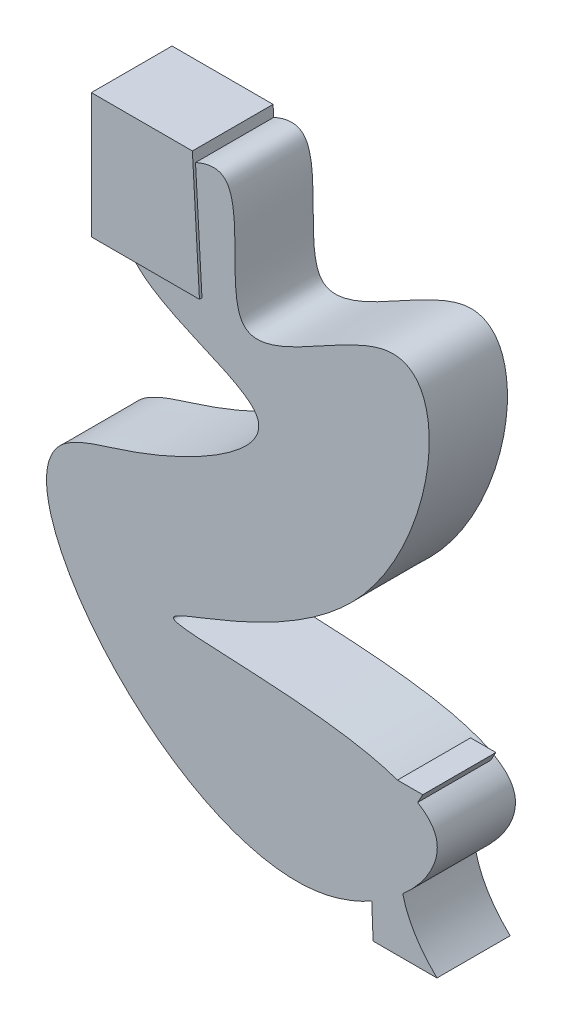
ISO-10303-21;
HEADER;
FILE_DESCRIPTION(('STEP AP214'),'2;1');
FILE_NAME('part.step','',(''),(''),'','','');
FILE_SCHEMA(('AUTOMOTIVE_DESIGN { 1 0 10303 214 1 1 1 1 }'));
ENDSEC;
DATA;
#1=APPLICATION_CONTEXT('core data for automotive mechanical design processes');
#2=APPLICATION_PROTOCOL_DEFINITION('international standard','automotive_design',2000,#1);
#3=PRODUCT_CONTEXT('',#1,'mechanical');
#4=PRODUCT('Part','Part','',(#3));
#5=PRODUCT_RELATED_PRODUCT_CATEGORY('part','',(#4));
#6=PRODUCT_DEFINITION_FORMATION('','',#4);
#7=PRODUCT_DEFINITION_CONTEXT('part definition',#1,'design');
#8=PRODUCT_DEFINITION('design','',#6,#7);
#9=PRODUCT_DEFINITION_SHAPE('','',#8);
#10=(LENGTH_UNIT() NAMED_UNIT(*) SI_UNIT(.MILLI.,.METRE.));
#11=(NAMED_UNIT(*) PLANE_ANGLE_UNIT() SI_UNIT($,.RADIAN.));
#12=(NAMED_UNIT(*) SI_UNIT($,.STERADIAN.) SOLID_ANGLE_UNIT());
#13=UNCERTAINTY_MEASURE_WITH_UNIT(LENGTH_MEASURE(1.E-05),#10,'distance_accuracy_value','');
#14=(GEOMETRIC_REPRESENTATION_CONTEXT(3) GLOBAL_UNCERTAINTY_ASSIGNED_CONTEXT((#13)) GLOBAL_UNIT_ASSIGNED_CONTEXT((#10,
#11,#12)) REPRESENTATION_CONTEXT('',''));
#15=CARTESIAN_POINT('',(0.,0.,0.));
#16=DIRECTION('',(0.,0.,1.));
#17=DIRECTION('',(1.,0.,0.));
#18=AXIS2_PLACEMENT_3D('',#15,#16,#17);
#19=CARTESIAN_POINT('',(-15.9579114672824,27.3125792420795,31.));
#20=CARTESIAN_POINT('',(-25.6408221690591,34.2496411082835,31.));
#21=CARTESIAN_POINT('',(-92.7059233373681,-25.2088498481276,31.));
#22=CARTESIAN_POINT('',(34.8425285028461,-42.1888332759727,31.));
#23=CARTESIAN_POINT('',(-42.5326846992211,-84.9102564767417,31.));
#24=CARTESIAN_POINT('',(-123.690777641917,-101.811790270533,31.));
#25=CARTESIAN_POINT('',(-5.24319580239329,-249.002191744904,31.));
#26=CARTESIAN_POINT('',(112.33595118914,-130.787067956798,31.));
#27=CARTESIAN_POINT('',(-101.777113136404,-142.952175341269,31.));
#28=CARTESIAN_POINT('',(61.7583482642269,-112.100404609053,31.));
#29=CARTESIAN_POINT('',(80.6764848376101,41.7227071032972,31.));
#30=CARTESIAN_POINT('',(-24.3178197996844,-52.6663732965618,31.));
#31=CARTESIAN_POINT('',(-7.43119536648631,21.2038420112459,31.));
#32=CARTESIAN_POINT('',(-15.9579114672824,27.3125792420795,31.));
#33=B_SPLINE_CURVE_WITH_KNOTS('',3,(#19,#20,#21,#22,#23,#24,#25,#26,#27,#28,#29,#30,#31,#32),
.UNSPECIFIED.,.T.,.F.,(4,1,1,1,1,1,1,1,1,1,1,4),(0.,0.0665290022160049,0.147826333462072,
0.222247527713655,0.261022342460717,0.442203314127407,0.516003534202006,0.647339484885778,
0.752660943172227,0.865759654440507,0.941414938974805,1.),.UNSPECIFIED.);
#34=DIRECTION('',(0.,0.,-1.));
#35=VECTOR('',#34,1.);
#36=SURFACE_OF_LINEAR_EXTRUSION('',#33,#35);
#37=CARTESIAN_POINT('',(55.189671373686,-183.461803067807,31.));
#38=VERTEX_POINT('',#37);
#39=CARTESIAN_POINT('',(61.0883800671705,-149.159472973881,31.));
#40=VERTEX_POINT('',#39);
#41=EDGE_CURVE('E278',#38,#40,#33,.T.);
#42=ORIENTED_EDGE('',*,*,#41,.F.);
#43=DIRECTION('',(0.,0.,1.));
#44=VECTOR('',#43,1.);
#45=CARTESIAN_POINT('',(55.1896713736861,-183.461803067807,2.00000000000002));
#46=LINE('',#45,#44);
#47=CARTESIAN_POINT('',(55.1896713736859,-183.461803067806,2.00000000000002));
#48=VERTEX_POINT('',#47);
#49=EDGE_CURVE('E210',#38,#48,#46,.F.);
#50=ORIENTED_EDGE('',*,*,#49,.T.);
#51=CARTESIAN_POINT('',(-15.9579114672824,27.3125792420795,2.00000000000002));
#52=CARTESIAN_POINT('',(-25.6408221690591,34.2496411082835,2.00000000000002));
#53=CARTESIAN_POINT('',(-92.7059233373681,-25.2088498481276,2.00000000000002));
#54=CARTESIAN_POINT('',(34.8425285028461,-42.1888332759727,2.00000000000002));
#55=CARTESIAN_POINT('',(-42.5326846992211,-84.9102564767417,2.00000000000002));
#56=CARTESIAN_POINT('',(-123.690777641917,-101.811790270533,2.00000000000002));
#57=CARTESIAN_POINT('',(-5.24319580239329,-249.002191744904,2.00000000000002));
#58=CARTESIAN_POINT('',(112.33595118914,-130.787067956798,2.00000000000002));
#59=CARTESIAN_POINT('',(-101.777113136404,-142.952175341269,2.00000000000002));
#60=CARTESIAN_POINT('',(61.7583482642269,-112.100404609053,2.00000000000002));
#61=CARTESIAN_POINT('',(80.6764848376101,41.7227071032972,2.00000000000002));
#62=CARTESIAN_POINT('',(-24.3178197996844,-52.6663732965618,2.00000000000002));
#63=CARTESIAN_POINT('',(-7.43119536648631,21.2038420112459,2.00000000000002));
#64=CARTESIAN_POINT('',(-15.9579114672824,27.3125792420795,2.00000000000002));
#65=B_SPLINE_CURVE_WITH_KNOTS('',3,(#51,#52,#53,#54,#55,#56,#57,#58,#59,#60,#61,#62,#63,#64),
.UNSPECIFIED.,.T.,.F.,(4,1,1,1,1,1,1,1,1,1,1,4),(0.,0.0665290022160049,0.147826333462072,
0.222247527713655,0.261022342460717,0.442203314127407,0.516003534202006,0.647339484885778,
0.752660943172227,0.865759654440507,0.941414938974805,1.),.UNSPECIFIED.);
#66=CARTESIAN_POINT('',(42.8929961040862,-192.125914514546,2.00000000000002));
#67=VERTEX_POINT('',#66);
#68=EDGE_CURVE('E11',#67,#48,#65,.T.);
#69=ORIENTED_EDGE('',*,*,#68,.F.);
#70=DIRECTION('',(0.,0.,-1.));
#71=VECTOR('',#70,1.);
#72=CARTESIAN_POINT('',(42.8929961040862,-192.125914514545,31.));
#73=LINE('',#72,#71);
#74=CARTESIAN_POINT('',(42.8929961040861,-192.125914514546,31.));
#75=VERTEX_POINT('',#74);
#76=EDGE_CURVE('E204',#67,#75,#73,.F.);
#77=ORIENTED_EDGE('',*,*,#76,.T.);
#78=CARTESIAN_POINT('',(-51.5784506059201,-18.6355593900152,31.));
#79=VERTEX_POINT('',#78);
#80=EDGE_CURVE('E272',#79,#75,#33,.T.);
#81=ORIENTED_EDGE('',*,*,#80,.F.);
#82=DIRECTION('',(0.,0.,-1.));
#83=VECTOR('',#82,1.);
#84=CARTESIAN_POINT('',(-51.5784506181621,-18.6355593749031,31.));
#85=LINE('',#84,#83);
#86=CARTESIAN_POINT('',(-51.5784506059201,-18.6355593900152,0.));
#87=VERTEX_POINT('',#86);
#88=EDGE_CURVE('E260',#87,#79,#85,.F.);
#89=ORIENTED_EDGE('',*,*,#88,.F.);
#90=CARTESIAN_POINT('',(-15.9579114672824,27.3125792420795,0.));
#91=CARTESIAN_POINT('',(-25.6408221690591,34.2496411082835,0.));
#92=CARTESIAN_POINT('',(-92.7059233373681,-25.2088498481276,0.));
#93=CARTESIAN_POINT('',(34.8425285028461,-42.1888332759727,0.));
#94=CARTESIAN_POINT('',(-42.5326846992211,-84.9102564767417,0.));
#95=CARTESIAN_POINT('',(-123.690777641917,-101.811790270533,0.));
#96=CARTESIAN_POINT('',(-5.24319580239329,-249.002191744904,0.));
#97=CARTESIAN_POINT('',(112.33595118914,-130.787067956798,0.));
#98=CARTESIAN_POINT('',(-101.777113136404,-142.952175341269,0.));
#99=CARTESIAN_POINT('',(61.7583482642269,-112.100404609053,0.));
#100=CARTESIAN_POINT('',(80.6764848376101,41.7227071032972,0.));
#101=CARTESIAN_POINT('',(-24.3178197996844,-52.6663732965618,0.));
#102=CARTESIAN_POINT('',(-7.43119536648631,21.2038420112459,0.));
#103=CARTESIAN_POINT('',(-15.9579114672824,27.3125792420795,0.));
#104=B_SPLINE_CURVE_WITH_KNOTS('',3,(#90,#91,#92,#93,#94,#95,#96,#97,#98,#99,#100,#101,#102,
#103),.UNSPECIFIED.,.T.,.F.,(4,1,1,1,1,1,1,1,1,1,1,4),(0.,0.0665290022160049,0.147826333462072,
0.222247527713655,0.261022342460717,0.442203314127407,0.516003534202006,0.647339484885778,
0.752660943172227,0.865759654440507,0.941414938974805,1.),.UNSPECIFIED.);
#105=CARTESIAN_POINT('',(-26.9784339330678,26.5567146381178,0.));
#106=VERTEX_POINT('',#105);
#107=EDGE_CURVE('E271',#87,#106,#104,.T.);
#108=ORIENTED_EDGE('',*,*,#107,.T.);
#109=DIRECTION('',(0.,0.,-1.));
#110=VECTOR('',#109,1.);
#111=CARTESIAN_POINT('',(-26.9784339332847,26.5567146380175,31.));
#112=LINE('',#111,#110);
#113=CARTESIAN_POINT('',(-26.9784339330678,26.5567146381178,31.));
#114=VERTEX_POINT('',#113);
#115=EDGE_CURVE('E268',#114,#106,#112,.T.);
#116=ORIENTED_EDGE('',*,*,#115,.F.);
#117=CARTESIAN_POINT('',(53.09308797691,-145.469515025717,31.));
#118=VERTEX_POINT('',#117);
#119=EDGE_CURVE('E279',#118,#114,#33,.T.);
#120=ORIENTED_EDGE('',*,*,#119,.F.);
#121=DIRECTION('',(0.,0.,-1.));
#122=VECTOR('',#121,1.);
#123=CARTESIAN_POINT('',(53.0930880176054,-145.469515040222,31.));
#124=LINE('',#123,#122);
#125=CARTESIAN_POINT('',(53.09308797691,-145.469515040222,2.00000000000002));
#126=VERTEX_POINT('',#125);
#127=EDGE_CURVE('E198',#118,#126,#124,.T.);
#128=ORIENTED_EDGE('',*,*,#127,.T.);
#129=CARTESIAN_POINT('',(61.0883800663589,-149.159472975432,2.00000000000002));
#130=VERTEX_POINT('',#129);
#131=EDGE_CURVE('E49',#130,#126,#65,.T.);
#132=ORIENTED_EDGE('',*,*,#131,.F.);
#133=DIRECTION('',(0.,0.,1.));
#134=VECTOR('',#133,1.);
#135=CARTESIAN_POINT('',(61.0883800671726,-149.159472973877,2.00000000000002));
#136=LINE('',#135,#134);
#137=EDGE_CURVE('E148',#130,#40,#136,.T.);
#138=ORIENTED_EDGE('',*,*,#137,.T.);
#139=EDGE_LOOP('',(#42,#50,#69,#77,#81,#89,#108,#116,#120,#128,#132,#138));
#140=FACE_BOUND('',#139,.T.);
#141=ADVANCED_FACE('F45',(#140),#36,.F.);
#142=CARTESIAN_POINT('',(67.5136866995857,-167.311195126365,31.));
#143=DIRECTION('',(0.,0.,-1.));
#144=DIRECTION('',(-1.,0.,0.));
#145=AXIS2_PLACEMENT_3D('',#142,#143,#144);
#146=PLANE('',#145);
#147=ORIENTED_EDGE('',*,*,#80,.T.);
#148=DIRECTION('',(0.0409014170082283,-0.99916318691529,0.));
#149=VECTOR('',#148,1.);
#150=CARTESIAN_POINT('',(40.9830850144939,-145.469515040222,31.));
#151=LINE('',#150,#149);
#152=CARTESIAN_POINT('',(43.444551911257,-205.599634946863,31.));
#153=VERTEX_POINT('',#152);
#154=EDGE_CURVE('E190',#75,#153,#151,.T.);
#155=ORIENTED_EDGE('',*,*,#154,.T.);
#156=DIRECTION('',(1.,0.,0.));
#157=VECTOR('',#156,1.);
#158=CARTESIAN_POINT('',(43.444551911257,-205.599634946863,31.));
#159=LINE('',#158,#157);
#160=CARTESIAN_POINT('',(68.7624971351058,-205.599634946863,31.));
#161=VERTEX_POINT('',#160);
#162=EDGE_CURVE('E154',#153,#161,#159,.T.);
#163=ORIENTED_EDGE('',*,*,#162,.T.);
#164=CARTESIAN_POINT('',(68.7624971351058,-205.599634946863,31.));
#165=CARTESIAN_POINT('',(42.6047193772417,-180.494440079804,31.));
#166=CARTESIAN_POINT('',(63.1362870853616,-145.469515040222,31.));
#167=B_SPLINE_CURVE_WITH_KNOTS('',2,(#164,#165,#166),.UNSPECIFIED.,.F.,.F.,(3,3),(0.,1.),.UNSPECIFIED.);
#168=EDGE_CURVE('E70',#161,#38,#167,.T.);
#169=ORIENTED_EDGE('',*,*,#168,.T.);
#170=ORIENTED_EDGE('',*,*,#41,.T.);
#171=CARTESIAN_POINT('',(63.1362870853616,-145.469515040222,31.));
#172=VERTEX_POINT('',#171);
#173=EDGE_CURVE('E184',#40,#172,#167,.T.);
#174=ORIENTED_EDGE('',*,*,#173,.T.);
#175=DIRECTION('',(-1.,0.,0.));
#176=VECTOR('',#175,1.);
#177=CARTESIAN_POINT('',(63.1362870853616,-145.469515040222,31.));
#178=LINE('',#177,#176);
#179=EDGE_CURVE('E63',#172,#118,#178,.T.);
#180=ORIENTED_EDGE('',*,*,#179,.T.);
#181=ORIENTED_EDGE('',*,*,#119,.T.);
#182=DIRECTION('',(-0.056646485034233,0.998394298728346,0.));
#183=VECTOR('',#182,1.);
#184=CARTESIAN_POINT('',(-15.7109233825337,-172.033158818968,31.));
#185=LINE('',#184,#183);
#186=CARTESIAN_POINT('',(-24.4143332800694,-18.6355593749031,31.));
#187=VERTEX_POINT('',#186);
#188=EDGE_CURVE('E264',#187,#114,#185,.T.);
#189=ORIENTED_EDGE('',*,*,#188,.F.);
#190=DIRECTION('',(1.,0.,0.));
#191=VECTOR('',#190,1.);
#192=CARTESIAN_POINT('',(67.5136866995857,-18.6355593749031,31.));
#193=LINE('',#192,#191);
#194=EDGE_CURVE('E256',#79,#187,#193,.T.);
#195=ORIENTED_EDGE('',*,*,#194,.F.);
#196=EDGE_LOOP('',(#147,#155,#163,#169,#170,#174,#180,#181,#189,#195));
#197=FACE_BOUND('',#196,.T.);
#198=ADVANCED_FACE('F296',(#197),#146,.F.);
#199=CARTESIAN_POINT('',(67.5136866995857,-167.311195126365,0.));
#200=DIRECTION('',(0.,0.,-1.));
#201=DIRECTION('',(-1.,0.,0.));
#202=AXIS2_PLACEMENT_3D('',#199,#200,#201);
#203=PLANE('',#202);
#204=ORIENTED_EDGE('',*,*,#107,.F.);
#205=DIRECTION('',(1.,0.,0.));
#206=VECTOR('',#205,1.);
#207=CARTESIAN_POINT('',(-67.2895357117868,-18.6355593749031,0.));
#208=LINE('',#207,#206);
#209=CARTESIAN_POINT('',(-67.2895357117868,-18.6355593749031,0.));
#210=VERTEX_POINT('',#209);
#211=EDGE_CURVE('E225',#210,#87,#208,.T.);
#212=ORIENTED_EDGE('',*,*,#211,.F.);
#213=DIRECTION('',(0.,-1.,0.));
#214=VECTOR('',#213,1.);
#215=CARTESIAN_POINT('',(-67.2895357117868,30.916928681426,0.));
#216=LINE('',#215,#214);
#217=CARTESIAN_POINT('',(-67.2895357117868,30.916928681426,0.));
#218=VERTEX_POINT('',#217);
#219=EDGE_CURVE('E221',#218,#210,#216,.T.);
#220=ORIENTED_EDGE('',*,*,#219,.F.);
#221=DIRECTION('',(-1.,0.,0.));
#222=VECTOR('',#221,1.);
#223=CARTESIAN_POINT('',(-27.2258219641164,30.916928681426,0.));
#224=LINE('',#223,#222);
#225=CARTESIAN_POINT('',(-27.2258219641164,30.916928681426,0.));
#226=VERTEX_POINT('',#225);
#227=EDGE_CURVE('E217',#226,#218,#224,.T.);
#228=ORIENTED_EDGE('',*,*,#227,.F.);
#229=DIRECTION('',(-0.056646485034233,0.998394298728346,0.));
#230=VECTOR('',#229,1.);
#231=CARTESIAN_POINT('',(-24.4143332800694,-18.6355593749031,0.));
#232=LINE('',#231,#230);
#233=EDGE_CURVE('E214',#106,#226,#232,.T.);
#234=ORIENTED_EDGE('',*,*,#233,.F.);
#235=EDGE_LOOP('',(#204,#212,#220,#228,#234));
#236=FACE_BOUND('',#235,.T.);
#237=ADVANCED_FACE('F310',(#236),#203,.T.);
#238=CARTESIAN_POINT('',(-24.4143332800694,-18.6355593749031,32.));
#239=DIRECTION('',(-0.998394298728346,-0.056646485034233,0.));
#240=DIRECTION('',(0.056646485034233,-0.998394298728346,0.));
#241=AXIS2_PLACEMENT_3D('',#238,#239,#240);
#242=PLANE('',#241);
#243=ORIENTED_EDGE('',*,*,#188,.T.);
#244=ORIENTED_EDGE('',*,*,#115,.T.);
#245=ORIENTED_EDGE('',*,*,#233,.T.);
#246=DIRECTION('',(0.,0.,-1.));
#247=VECTOR('',#246,1.);
#248=CARTESIAN_POINT('',(-27.2258219641164,30.916928681426,32.));
#249=LINE('',#248,#247);
#250=CARTESIAN_POINT('',(-27.2258219641164,30.916928681426,32.));
#251=VERTEX_POINT('',#250);
#252=EDGE_CURVE('E252',#251,#226,#249,.T.);
#253=ORIENTED_EDGE('',*,*,#252,.F.);
#254=DIRECTION('',(-0.056646485034233,0.998394298728346,0.));
#255=VECTOR('',#254,1.);
#256=CARTESIAN_POINT('',(-24.4143332800694,-18.6355593749031,32.));
#257=LINE('',#256,#255);
#258=CARTESIAN_POINT('',(-24.4143332800694,-18.6355593749031,32.));
#259=VERTEX_POINT('',#258);
#260=EDGE_CURVE('E229',#259,#251,#257,.T.);
#261=ORIENTED_EDGE('',*,*,#260,.F.);
#262=DIRECTION('',(0.,0.,-1.));
#263=VECTOR('',#262,1.);
#264=CARTESIAN_POINT('',(-24.4143332800694,-18.6355593749031,32.));
#265=LINE('',#264,#263);
#266=EDGE_CURVE('E242',#259,#187,#265,.T.);
#267=ORIENTED_EDGE('',*,*,#266,.T.);
#268=EDGE_LOOP('',(#243,#244,#245,#253,#261,#267));
#269=FACE_BOUND('',#268,.T.);
#270=ADVANCED_FACE('F301',(#269),#242,.F.);
#271=CARTESIAN_POINT('',(-67.2895357117868,-18.6355593749031,32.));
#272=DIRECTION('',(0.,1.,0.));
#273=DIRECTION('',(0.,0.,1.));
#274=AXIS2_PLACEMENT_3D('',#271,#272,#273);
#275=PLANE('',#274);
#276=ORIENTED_EDGE('',*,*,#211,.T.);
#277=ORIENTED_EDGE('',*,*,#88,.T.);
#278=ORIENTED_EDGE('',*,*,#194,.T.);
#279=ORIENTED_EDGE('',*,*,#266,.F.);
#280=DIRECTION('',(1.,0.,0.));
#281=VECTOR('',#280,1.);
#282=CARTESIAN_POINT('',(-67.2895357117868,-18.6355593749031,32.));
#283=LINE('',#282,#281);
#284=CARTESIAN_POINT('',(-67.2895357117868,-18.6355593749031,32.));
#285=VERTEX_POINT('',#284);
#286=EDGE_CURVE('E239',#285,#259,#283,.T.);
#287=ORIENTED_EDGE('',*,*,#286,.F.);
#288=DIRECTION('',(0.,0.,-1.));
#289=VECTOR('',#288,1.);
#290=CARTESIAN_POINT('',(-67.2895357117868,-18.6355593749031,32.));
#291=LINE('',#290,#289);
#292=EDGE_CURVE('E246',#285,#210,#291,.T.);
#293=ORIENTED_EDGE('',*,*,#292,.T.);
#294=EDGE_LOOP('',(#276,#277,#278,#279,#287,#293));
#295=FACE_BOUND('',#294,.T.);
#296=ADVANCED_FACE('F306',(#295),#275,.F.);
#297=CARTESIAN_POINT('',(-27.2258219641164,30.916928681426,32.));
#298=DIRECTION('',(0.,-1.,0.));
#299=DIRECTION('',(0.,0.,-1.));
#300=AXIS2_PLACEMENT_3D('',#297,#298,#299);
#301=PLANE('',#300);
#302=ORIENTED_EDGE('',*,*,#252,.T.);
#303=ORIENTED_EDGE('',*,*,#227,.T.);
#304=DIRECTION('',(0.,0.,-1.));
#305=VECTOR('',#304,1.);
#306=CARTESIAN_POINT('',(-67.2895357117868,30.916928681426,32.));
#307=LINE('',#306,#305);
#308=CARTESIAN_POINT('',(-67.2895357117868,30.916928681426,32.));
#309=VERTEX_POINT('',#308);
#310=EDGE_CURVE('E249',#309,#218,#307,.T.);
#311=ORIENTED_EDGE('',*,*,#310,.F.);
#312=DIRECTION('',(-1.,0.,0.));
#313=VECTOR('',#312,1.);
#314=CARTESIAN_POINT('',(-27.2258219641164,30.916928681426,32.));
#315=LINE('',#314,#313);
#316=EDGE_CURVE('E233',#251,#309,#315,.T.);
#317=ORIENTED_EDGE('',*,*,#316,.F.);
#318=EDGE_LOOP('',(#302,#303,#311,#317));
#319=FACE_BOUND('',#318,.T.);
#320=ADVANCED_FACE('F315',(#319),#301,.F.);
#321=CARTESIAN_POINT('',(-67.2895357117868,30.916928681426,32.));
#322=DIRECTION('',(1.,0.,0.));
#323=DIRECTION('',(0.,0.,-1.));
#324=AXIS2_PLACEMENT_3D('',#321,#322,#323);
#325=PLANE('',#324);
#326=ORIENTED_EDGE('',*,*,#310,.T.);
#327=ORIENTED_EDGE('',*,*,#219,.T.);
#328=ORIENTED_EDGE('',*,*,#292,.F.);
#329=DIRECTION('',(0.,-1.,0.));
#330=VECTOR('',#329,1.);
#331=CARTESIAN_POINT('',(-67.2895357117868,30.916928681426,32.));
#332=LINE('',#331,#330);
#333=EDGE_CURVE('E236',#309,#285,#332,.T.);
#334=ORIENTED_EDGE('',*,*,#333,.F.);
#335=EDGE_LOOP('',(#326,#327,#328,#334));
#336=FACE_BOUND('',#335,.T.);
#337=ADVANCED_FACE('F322',(#336),#325,.F.);
#338=CARTESIAN_POINT('',(0.,0.,32.));
#339=DIRECTION('',(0.,0.,1.));
#340=DIRECTION('',(1.,0.,0.));
#341=AXIS2_PLACEMENT_3D('',#338,#339,#340);
#342=PLANE('',#341);
#343=ORIENTED_EDGE('',*,*,#260,.T.);
#344=ORIENTED_EDGE('',*,*,#316,.T.);
#345=ORIENTED_EDGE('',*,*,#333,.T.);
#346=ORIENTED_EDGE('',*,*,#286,.T.);
#347=EDGE_LOOP('',(#343,#344,#345,#346));
#348=FACE_BOUND('',#347,.T.);
#349=ADVANCED_FACE('F319',(#348),#342,.T.);
#350=CARTESIAN_POINT('',(54.2770557437377,-178.014507536673,2.00000000000002));
#351=DIRECTION('',(0.,0.,1.));
#352=DIRECTION('',(1.,0.,0.));
#353=AXIS2_PLACEMENT_3D('',#350,#351,#352);
#354=PLANE('',#353);
#355=CARTESIAN_POINT('',(68.7624971351058,-205.599634946863,2.00000000000002));
#356=CARTESIAN_POINT('',(42.6047193772417,-180.494440079804,2.00000000000002));
#357=CARTESIAN_POINT('',(63.1362870853616,-145.469515040222,2.00000000000002));
#358=B_SPLINE_CURVE_WITH_KNOTS('',2,(#355,#356,#357),.UNSPECIFIED.,.F.,.F.,(3,3),(0.,1.),.UNSPECIFIED.);
#359=CARTESIAN_POINT('',(63.1362870853616,-145.469515040222,2.00000000000002));
#360=VERTEX_POINT('',#359);
#361=EDGE_CURVE('E143',#130,#360,#358,.T.);
#362=ORIENTED_EDGE('',*,*,#361,.F.);
#363=ORIENTED_EDGE('',*,*,#131,.T.);
#364=DIRECTION('',(-1.,0.,0.));
#365=VECTOR('',#364,1.);
#366=CARTESIAN_POINT('',(63.1362870853616,-145.469515040222,2.00000000000002));
#367=LINE('',#366,#365);
#368=EDGE_CURVE('E159',#360,#126,#367,.T.);
#369=ORIENTED_EDGE('',*,*,#368,.F.);
#370=EDGE_LOOP('',(#362,#363,#369));
#371=FACE_BOUND('',#370,.T.);
#372=ADVANCED_FACE('F165',(#371),#354,.F.);
#373=CARTESIAN_POINT('',(63.1362870853616,-145.469515040222,2.00000000000002));
#374=DIRECTION('',(0.,1.,0.));
#375=DIRECTION('',(0.,0.,1.));
#376=AXIS2_PLACEMENT_3D('',#373,#374,#375);
#377=PLANE('',#376);
#378=ORIENTED_EDGE('',*,*,#127,.F.);
#379=ORIENTED_EDGE('',*,*,#179,.F.);
#380=DIRECTION('',(0.,0.,1.));
#381=VECTOR('',#380,1.);
#382=CARTESIAN_POINT('',(63.1362870853616,-145.469515040222,2.00000000000002));
#383=LINE('',#382,#381);
#384=EDGE_CURVE('E146',#360,#172,#383,.T.);
#385=ORIENTED_EDGE('',*,*,#384,.F.);
#386=ORIENTED_EDGE('',*,*,#368,.T.);
#387=EDGE_LOOP('',(#378,#379,#385,#386));
#388=FACE_BOUND('',#387,.T.);
#389=ADVANCED_FACE('F158',(#388),#377,.T.);
#390=DIRECTION('',(0.,0.,1.));
#391=VECTOR('',#390,1.);
#392=SURFACE_OF_LINEAR_EXTRUSION('',#358,#391);
#393=ORIENTED_EDGE('',*,*,#137,.F.);
#394=ORIENTED_EDGE('',*,*,#361,.T.);
#395=ORIENTED_EDGE('',*,*,#384,.T.);
#396=ORIENTED_EDGE('',*,*,#173,.F.);
#397=EDGE_LOOP('',(#393,#394,#395,#396));
#398=FACE_BOUND('',#397,.T.);
#399=ADVANCED_FACE('F145',(#398),#392,.T.);
#400=DIRECTION('',(0.0409014170082283,-0.99916318691529,0.));
#401=VECTOR('',#400,1.);
#402=CARTESIAN_POINT('',(40.9830850144939,-145.469515040222,2.00000000000002));
#403=LINE('',#402,#401);
#404=CARTESIAN_POINT('',(43.444551911257,-205.599634946863,2.00000000000002));
#405=VERTEX_POINT('',#404);
#406=EDGE_CURVE('E167',#67,#405,#403,.T.);
#407=ORIENTED_EDGE('',*,*,#406,.F.);
#408=ORIENTED_EDGE('',*,*,#68,.T.);
#409=CARTESIAN_POINT('',(68.7624971351058,-205.599634946863,2.00000000000002));
#410=VERTEX_POINT('',#409);
#411=EDGE_CURVE('E153',#410,#48,#358,.T.);
#412=ORIENTED_EDGE('',*,*,#411,.F.);
#413=DIRECTION('',(1.,0.,0.));
#414=VECTOR('',#413,1.);
#415=CARTESIAN_POINT('',(43.444551911257,-205.599634946863,2.00000000000002));
#416=LINE('',#415,#414);
#417=EDGE_CURVE('E163',#405,#410,#416,.T.);
#418=ORIENTED_EDGE('',*,*,#417,.F.);
#419=EDGE_LOOP('',(#407,#408,#412,#418));
#420=FACE_BOUND('',#419,.T.);
#421=ADVANCED_FACE('F353',(#420),#354,.F.);
#422=ORIENTED_EDGE('',*,*,#49,.F.);
#423=ORIENTED_EDGE('',*,*,#168,.F.);
#424=DIRECTION('',(0.,0.,1.));
#425=VECTOR('',#424,1.);
#426=CARTESIAN_POINT('',(68.7624971351058,-205.599634946863,2.00000000000002));
#427=LINE('',#426,#425);
#428=EDGE_CURVE('E195',#410,#161,#427,.T.);
#429=ORIENTED_EDGE('',*,*,#428,.F.);
#430=ORIENTED_EDGE('',*,*,#411,.T.);
#431=EDGE_LOOP('',(#422,#423,#429,#430));
#432=FACE_BOUND('',#431,.T.);
#433=ADVANCED_FACE('F349',(#432),#392,.T.);
#434=CARTESIAN_POINT('',(40.9830850144939,-145.469515040222,2.00000000000002));
#435=DIRECTION('',(-0.99916318691529,-0.0409014170082283,0.));
#436=DIRECTION('',(0.0409014170082283,-0.99916318691529,0.));
#437=AXIS2_PLACEMENT_3D('',#434,#435,#436);
#438=PLANE('',#437);
#439=ORIENTED_EDGE('',*,*,#76,.F.);
#440=ORIENTED_EDGE('',*,*,#406,.T.);
#441=DIRECTION('',(0.,0.,1.));
#442=VECTOR('',#441,1.);
#443=CARTESIAN_POINT('',(43.444551911257,-205.599634946863,2.00000000000002));
#444=LINE('',#443,#442);
#445=EDGE_CURVE('E162',#405,#153,#444,.T.);
#446=ORIENTED_EDGE('',*,*,#445,.T.);
#447=ORIENTED_EDGE('',*,*,#154,.F.);
#448=EDGE_LOOP('',(#439,#440,#446,#447));
#449=FACE_BOUND('',#448,.T.);
#450=ADVANCED_FACE('F352',(#449),#438,.T.);
#451=CARTESIAN_POINT('',(43.444551911257,-205.599634946863,2.00000000000002));
#452=DIRECTION('',(0.,-1.,0.));
#453=DIRECTION('',(0.,0.,-1.));
#454=AXIS2_PLACEMENT_3D('',#451,#452,#453);
#455=PLANE('',#454);
#456=ORIENTED_EDGE('',*,*,#162,.F.);
#457=ORIENTED_EDGE('',*,*,#445,.F.);
#458=ORIENTED_EDGE('',*,*,#417,.T.);
#459=ORIENTED_EDGE('',*,*,#428,.T.);
#460=EDGE_LOOP('',(#456,#457,#458,#459));
#461=FACE_BOUND('',#460,.T.);
#462=ADVANCED_FACE('F359',(#461),#455,.T.);
#463=CLOSED_SHELL('',(#141,#198,#237,#270,#296,#320,#337,#349,#372,#389,#399,#421,#433,#450,#462));
#464=MANIFOLD_SOLID_BREP('B2',#463);
#465=ADVANCED_BREP_SHAPE_REPRESENTATION('',(#18,#464),#14);
#466=SHAPE_DEFINITION_REPRESENTATION(#9,#465);
ENDSEC;
END-ISO-10303-21;
